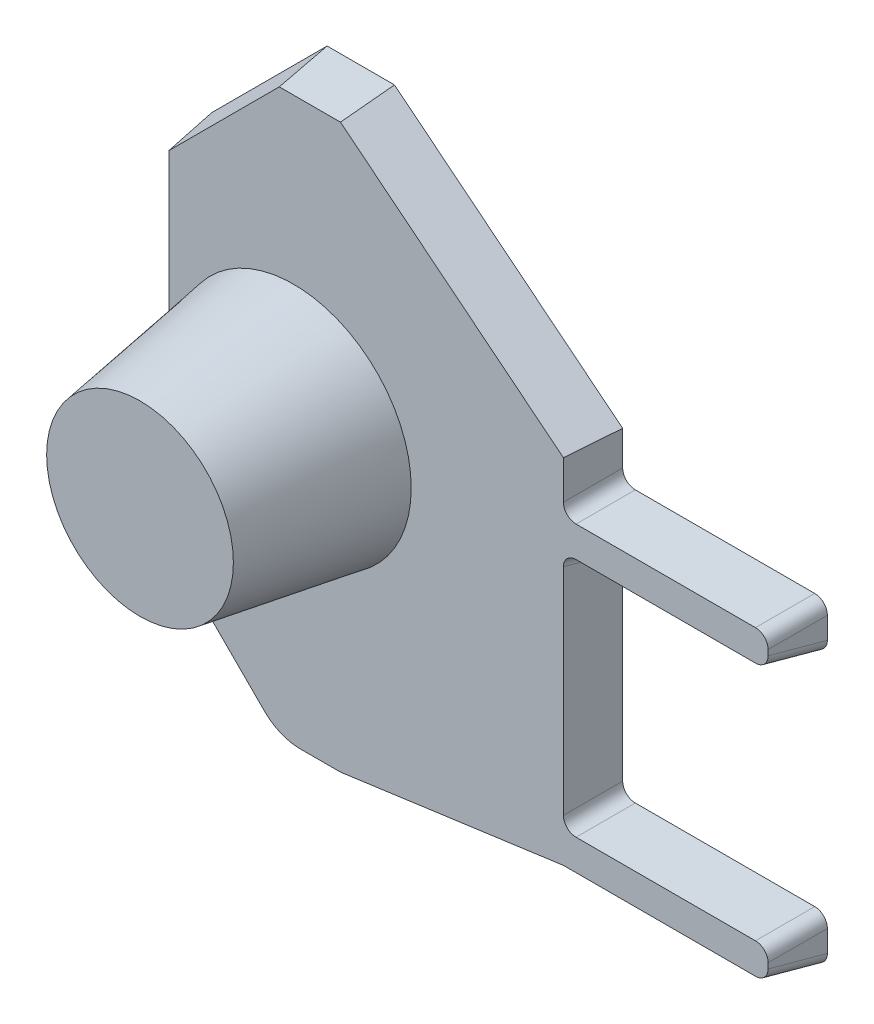
ISO-10303-21;
HEADER;
FILE_DESCRIPTION(('STEP AP214'),'2;1');
FILE_NAME('part.step','',(''),(''),'','','');
FILE_SCHEMA(('AUTOMOTIVE_DESIGN { 1 0 10303 214 1 1 1 1 }'));
ENDSEC;
DATA;
#1=APPLICATION_CONTEXT('core data for automotive mechanical design processes');
#2=APPLICATION_PROTOCOL_DEFINITION('international standard','automotive_design',2000,#1);
#3=PRODUCT_CONTEXT('',#1,'mechanical');
#4=PRODUCT('Part','Part','',(#3));
#5=PRODUCT_RELATED_PRODUCT_CATEGORY('part','',(#4));
#6=PRODUCT_DEFINITION_FORMATION('','',#4);
#7=PRODUCT_DEFINITION_CONTEXT('part definition',#1,'design');
#8=PRODUCT_DEFINITION('design','',#6,#7);
#9=PRODUCT_DEFINITION_SHAPE('','',#8);
#10=(LENGTH_UNIT() NAMED_UNIT(*) SI_UNIT(.MILLI.,.METRE.));
#11=(NAMED_UNIT(*) PLANE_ANGLE_UNIT() SI_UNIT($,.RADIAN.));
#12=(NAMED_UNIT(*) SI_UNIT($,.STERADIAN.) SOLID_ANGLE_UNIT());
#13=UNCERTAINTY_MEASURE_WITH_UNIT(LENGTH_MEASURE(1.E-05),#10,'distance_accuracy_value','');
#14=(GEOMETRIC_REPRESENTATION_CONTEXT(3) GLOBAL_UNCERTAINTY_ASSIGNED_CONTEXT((#13)) GLOBAL_UNIT_ASSIGNED_CONTEXT((#10,
#11,#12)) REPRESENTATION_CONTEXT('',''));
#15=CARTESIAN_POINT('',(0.,0.,0.));
#16=DIRECTION('',(0.,0.,1.));
#17=DIRECTION('',(1.,0.,0.));
#18=AXIS2_PLACEMENT_3D('',#15,#16,#17);
#19=CARTESIAN_POINT('',(-40.4268302290652,-40.6742121299792,-0.0633693031585517));
#20=DIRECTION('',(-0.69840112333371,-0.69840112333371,0.156434465040231));
#21=DIRECTION('',(0.707106781186547,-0.707106781186547,0.));
#22=AXIS2_PLACEMENT_3D('',#19,#20,#21);
#23=PLANE('',#22);
#24=DIRECTION('',(0.707106781186547,-0.707106781186547,0.));
#25=VECTOR('',#24,1.);
#26=CARTESIAN_POINT('',(-41.6027747028383,-41.8501566037523,-10.5633693031586));
#27=LINE('',#26,#25);
#28=CARTESIAN_POINT('',(-47.8486528709108,-35.6042784356798,-10.5633693031586));
#29=VERTEX_POINT('',#28);
#30=CARTESIAN_POINT('',(-27.2386149479719,-56.2143163586187,-10.5633693031586));
#31=VERTEX_POINT('',#30);
#32=EDGE_CURVE('E261',#29,#31,#27,.T.);
#33=ORIENTED_EDGE('',*,*,#32,.T.);
#34=DIRECTION('',(0.0646616721689631,0.156107085916033,0.98562135015386));
#35=VECTOR('',#34,1.);
#36=CARTESIAN_POINT('',(-26.4677073376156,-54.3531807503599,1.18737846250103));
#37=LINE('',#36,#35);
#38=CARTESIAN_POINT('',(-26.5497626238333,-54.5512797352111,-0.0633693031585517));
#39=VERTEX_POINT('',#38);
#40=EDGE_CURVE('E313',#31,#39,#37,.T.);
#41=ORIENTED_EDGE('',*,*,#40,.T.);
#42=DIRECTION('',(0.707106781186548,-0.707106781186548,0.));
#43=VECTOR('',#42,1.);
#44=CARTESIAN_POINT('',(-40.4268302290652,-40.6742121299792,-0.0633693031585517));
#45=LINE('',#44,#43);
#46=CARTESIAN_POINT('',(-46.1856162475031,-34.9154261115412,-0.0633693031585517));
#47=VERTEX_POINT('',#46);
#48=EDGE_CURVE('E211',#47,#39,#45,.T.);
#49=ORIENTED_EDGE('',*,*,#48,.F.);
#50=DIRECTION('',(0.156107085916033,0.064661672168963,0.98562135015386));
#51=VECTOR('',#50,1.);
#52=CARTESIAN_POINT('',(-45.8315476447022,-34.7687660942506,2.17213187407477));
#53=LINE('',#52,#51);
#54=EDGE_CURVE('E262',#29,#47,#53,.T.);
#55=ORIENTED_EDGE('',*,*,#54,.F.);
#56=EDGE_LOOP('',(#33,#41,#49,#55));
#57=FACE_BOUND('',#56,.T.);
#58=ADVANCED_FACE('F44',(#57),#23,.T.);
#59=CARTESIAN_POINT('',(-46.1856162475032,0.161204483543927,-0.0633693031585517));
#60=DIRECTION('',(-0.987688340595138,0.,0.156434465040231));
#61=DIRECTION('',(0.156434465040231,0.,0.987688340595138));
#62=AXIS2_PLACEMENT_3D('',#59,#60,#61);
#63=PLANE('',#62);
#64=DIRECTION('',(0.,-1.,0.));
#65=VECTOR('',#64,1.);
#66=CARTESIAN_POINT('',(-46.1856162475032,0.161204483543927,-0.0633693031585517));
#67=LINE('',#66,#65);
#68=CARTESIAN_POINT('',(-46.1856162475032,35.2378350786292,-0.0633693031585517));
#69=VERTEX_POINT('',#68);
#70=EDGE_CURVE('E258',#69,#47,#67,.T.);
#71=ORIENTED_EDGE('',*,*,#70,.F.);
#72=DIRECTION('',(0.156107085916033,-0.0646616721689629,0.98562135015386));
#73=VECTOR('',#72,1.);
#74=CARTESIAN_POINT('',(-46.1034079815582,35.2037832999356,0.455673260470475));
#75=LINE('',#74,#73);
#76=CARTESIAN_POINT('',(-47.8486528709108,35.9266874027678,-10.5633693031586));
#77=VERTEX_POINT('',#76);
#78=EDGE_CURVE('E264',#77,#69,#75,.T.);
#79=ORIENTED_EDGE('',*,*,#78,.F.);
#80=DIRECTION('',(0.,-1.,0.));
#81=VECTOR('',#80,1.);
#82=CARTESIAN_POINT('',(-47.8486528709108,0.161204483543925,-10.5633693031586));
#83=LINE('',#82,#81);
#84=EDGE_CURVE('E222',#77,#29,#83,.T.);
#85=ORIENTED_EDGE('',*,*,#84,.T.);
#86=ORIENTED_EDGE('',*,*,#54,.T.);
#87=EDGE_LOOP('',(#71,#79,#85,#86));
#88=FACE_BOUND('',#87,.T.);
#89=ADVANCED_FACE('F466',(#88),#63,.T.);
#90=CARTESIAN_POINT('',(-40.4268302290653,40.9966210970671,-0.0633693031585517));
#91=DIRECTION('',(-0.69840112333371,0.69840112333371,0.156434465040231));
#92=DIRECTION('',(-0.707106781186547,-0.707106781186547,0.));
#93=AXIS2_PLACEMENT_3D('',#90,#91,#92);
#94=PLANE('',#93);
#95=DIRECTION('',(-0.707106781186548,-0.707106781186548,0.));
#96=VECTOR('',#95,1.);
#97=CARTESIAN_POINT('',(-40.4268302290653,40.9966210970671,-0.0633693031585517));
#98=LINE('',#97,#96);
#99=CARTESIAN_POINT('',(-23.5122468425885,57.911204483544,-0.0633693031585517));
#100=VERTEX_POINT('',#99);
#101=EDGE_CURVE('E255',#100,#69,#98,.T.);
#102=ORIENTED_EDGE('',*,*,#101,.F.);
#103=DIRECTION('',(-0.0646616721689629,0.156107085916033,-0.98562135015386));
#104=VECTOR('',#103,1.);
#105=CARTESIAN_POINT('',(-23.4122306849597,57.6697441193401,1.46115143706775));
#106=LINE('',#105,#104);
#107=CARTESIAN_POINT('',(-24.2010991667271,59.5742411069516,-10.5633693031586));
#108=VERTEX_POINT('',#107);
#109=EDGE_CURVE('E273',#108,#100,#106,.F.);
#110=ORIENTED_EDGE('',*,*,#109,.F.);
#111=DIRECTION('',(-0.707106781186547,-0.707106781186547,0.));
#112=VECTOR('',#111,1.);
#113=CARTESIAN_POINT('',(-41.6027747028384,42.1725655708403,-10.5633693031586));
#114=LINE('',#113,#112);
#115=EDGE_CURVE('E280',#108,#77,#114,.T.);
#116=ORIENTED_EDGE('',*,*,#115,.T.);
#117=ORIENTED_EDGE('',*,*,#78,.T.);
#118=EDGE_LOOP('',(#102,#110,#116,#117));
#119=FACE_BOUND('',#118,.T.);
#120=ADVANCED_FACE('F471',(#119),#94,.T.);
#121=CARTESIAN_POINT('',(0.408586384457905,57.911204483544,-0.0633693031585517));
#122=DIRECTION('',(0.,0.987688340595138,0.156434465040231));
#123=DIRECTION('',(0.,-0.156434465040231,0.987688340595138));
#124=AXIS2_PLACEMENT_3D('',#121,#122,#123);
#125=PLANE('',#124);
#126=DIRECTION('',(1.,0.,0.));
#127=VECTOR('',#126,1.);
#128=CARTESIAN_POINT('',(0.408586384457905,57.911204483544,-0.0633693031585517));
#129=LINE('',#128,#127);
#130=CARTESIAN_POINT('',(-10.9585190266833,57.911204483544,-0.0633693031585517));
#131=VERTEX_POINT('',#130);
#132=EDGE_CURVE('E253',#100,#131,#129,.T.);
#133=ORIENTED_EDGE('',*,*,#132,.T.);
#134=DIRECTION('',(-0.0549699216954338,-0.156197937818383,0.986194966489934));
#135=VECTOR('',#134,1.);
#136=CARTESIAN_POINT('',(-11.0945846883405,57.5245716650274,2.37773424037382));
#137=LINE('',#136,#135);
#138=CARTESIAN_POINT('',(-10.3732552630115,59.5742411069516,-10.5633693031586));
#139=VERTEX_POINT('',#138);
#140=EDGE_CURVE('E270',#139,#131,#137,.T.);
#141=ORIENTED_EDGE('',*,*,#140,.F.);
#142=DIRECTION('',(-1.,0.,0.));
#143=VECTOR('',#142,1.);
#144=CARTESIAN_POINT('',(0.408586384457905,59.5742411069516,-10.5633693031586));
#145=LINE('',#144,#143);
#146=EDGE_CURVE('E283',#108,#139,#145,.F.);
#147=ORIENTED_EDGE('',*,*,#146,.F.);
#148=ORIENTED_EDGE('',*,*,#109,.T.);
#149=EDGE_LOOP('',(#133,#141,#147,#148));
#150=FACE_BOUND('',#149,.T.);
#151=ADVANCED_FACE('F505',(#150),#125,.T.);
#152=CARTESIAN_POINT('',(24.1463617540273,29.7098888695739,-0.0633693031585517));
#153=DIRECTION('',(0.618573050083184,0.769997168733992,0.156434465040231));
#154=DIRECTION('',(-0.779595280298667,0.62628364096154,0.));
#155=AXIS2_PLACEMENT_3D('',#152,#153,#154);
#156=PLANE('',#155);
#157=DIRECTION('',(0.779595280298667,-0.62628364096154,0.));
#158=VECTOR('',#157,1.);
#159=CARTESIAN_POINT('',(24.1463617540273,29.7098888695739,-0.0633693031585517));
#160=LINE('',#159,#158);
#161=CARTESIAN_POINT('',(34.7877286431252,21.161204483544,-0.0633693031585517));
#162=VERTEX_POINT('',#161);
#163=EDGE_CURVE('E251',#131,#162,#160,.T.);
#164=ORIENTED_EDGE('',*,*,#163,.T.);
#165=DIRECTION('',(-0.155996452907658,-0.0747803737103569,0.98492284082966));
#166=VECTOR('',#165,1.);
#167=CARTESIAN_POINT('',(34.5427537091607,21.0437702934065,1.48334155721672));
#168=LINE('',#167,#166);
#169=CARTESIAN_POINT('',(36.4507652665328,21.9584181244596,-10.5633693031586));
#170=VERTEX_POINT('',#169);
#171=EDGE_CURVE('E267',#170,#162,#168,.T.);
#172=ORIENTED_EDGE('',*,*,#171,.F.);
#173=DIRECTION('',(-0.779595280298667,0.62628364096154,0.));
#174=VECTOR('',#173,1.);
#175=CARTESIAN_POINT('',(25.1878943855874,31.0063843721463,-10.5633693031586));
#176=LINE('',#175,#174);
#177=EDGE_CURVE('E285',#139,#170,#176,.F.);
#178=ORIENTED_EDGE('',*,*,#177,.F.);
#179=ORIENTED_EDGE('',*,*,#140,.T.);
#180=EDGE_LOOP('',(#164,#172,#178,#179));
#181=FACE_BOUND('',#180,.T.);
#182=ADVANCED_FACE('F501',(#181),#156,.T.);
#183=CARTESIAN_POINT('',(34.7877286431252,0.161204483543965,-0.0633693031585517));
#184=DIRECTION('',(0.987688340595138,0.,0.156434465040231));
#185=DIRECTION('',(0.156434465040231,0.,-0.987688340595138));
#186=AXIS2_PLACEMENT_3D('',#183,#184,#185);
#187=PLANE('',#186);
#188=DIRECTION('',(0.,-1.,0.));
#189=VECTOR('',#188,1.);
#190=CARTESIAN_POINT('',(34.7877286431252,0.161204483543965,-0.0633693031585517));
#191=LINE('',#190,#189);
#192=CARTESIAN_POINT('',(34.7877286431252,13.2538863776062,-0.0633693031585517));
#193=VERTEX_POINT('',#192);
#194=EDGE_CURVE('E248',#162,#193,#191,.T.);
#195=ORIENTED_EDGE('',*,*,#194,.T.);
#196=DIRECTION('',(0.154554782932108,0.154554782932108,-0.975820494837866));
#197=VECTOR('',#196,1.);
#198=CARTESIAN_POINT('',(36.3888334050427,14.8549911395237,-10.1723469188687));
#199=LINE('',#198,#197);
#200=CARTESIAN_POINT('',(36.4507652665328,14.9169230010138,-10.5633693031586));
#201=VERTEX_POINT('',#200);
#202=EDGE_CURVE('E368',#193,#201,#199,.T.);
#203=ORIENTED_EDGE('',*,*,#202,.T.);
#204=DIRECTION('',(0.,1.,0.));
#205=VECTOR('',#204,1.);
#206=CARTESIAN_POINT('',(36.4507652665328,0.161204483543965,-10.5633693031586));
#207=LINE('',#206,#205);
#208=EDGE_CURVE('E287',#170,#201,#207,.F.);
#209=ORIENTED_EDGE('',*,*,#208,.F.);
#210=ORIENTED_EDGE('',*,*,#171,.T.);
#211=EDGE_LOOP('',(#195,#203,#209,#210));
#212=FACE_BOUND('',#211,.T.);
#213=ADVANCED_FACE('F497',(#212),#187,.T.);
#214=CARTESIAN_POINT('',(0.408586384457905,10.661204483544,-0.0633693031585517));
#215=DIRECTION('',(0.,0.987688340595138,0.156434465040231));
#216=DIRECTION('',(0.,-0.156434465040231,0.987688340595138));
#217=AXIS2_PLACEMENT_3D('',#214,#215,#216);
#218=PLANE('',#217);
#219=DIRECTION('',(1.,0.,0.));
#220=VECTOR('',#219,1.);
#221=CARTESIAN_POINT('',(0.408586384457905,10.661204483544,-0.0633693031585517));
#222=LINE('',#221,#220);
#223=CARTESIAN_POINT('',(37.3804105371874,10.661204483544,-0.0633693031585517));
#224=VERTEX_POINT('',#223);
#225=CARTESIAN_POINT('',(74.1950467490629,10.661204483544,-0.0633693031585517));
#226=VERTEX_POINT('',#225);
#227=EDGE_CURVE('E245',#224,#226,#222,.T.);
#228=ORIENTED_EDGE('',*,*,#227,.T.);
#229=DIRECTION('',(-0.154554782932108,-0.154554782932108,0.975820494837866));
#230=VECTOR('',#229,1.);
#231=CARTESIAN_POINT('',(75.9200152339607,12.3861729684417,-10.9543916874484));
#232=LINE('',#231,#230);
#233=CARTESIAN_POINT('',(75.8580833724706,12.3242411069516,-10.5633693031586));
#234=VERTEX_POINT('',#233);
#235=EDGE_CURVE('E348',#226,#234,#232,.F.);
#236=ORIENTED_EDGE('',*,*,#235,.T.);
#237=DIRECTION('',(-1.,0.,0.));
#238=VECTOR('',#237,1.);
#239=CARTESIAN_POINT('',(0.408586384457905,12.3242411069516,-10.5633693031586));
#240=LINE('',#239,#238);
#241=CARTESIAN_POINT('',(39.043447160595,12.3242411069516,-10.5633693031586));
#242=VERTEX_POINT('',#241);
#243=EDGE_CURVE('E290',#242,#234,#240,.F.);
#244=ORIENTED_EDGE('',*,*,#243,.F.);
#245=DIRECTION('',(0.154554782932108,0.154554782932108,-0.975820494837866));
#246=VECTOR('',#245,1.);
#247=CARTESIAN_POINT('',(37.3184786756973,10.5992726220539,0.327653081131317));
#248=LINE('',#247,#246);
#249=EDGE_CURVE('E345',#242,#224,#248,.F.);
#250=ORIENTED_EDGE('',*,*,#249,.T.);
#251=EDGE_LOOP('',(#228,#236,#244,#250));
#252=FACE_BOUND('',#251,.T.);
#253=ADVANCED_FACE('F493',(#252),#218,.T.);
#254=CARTESIAN_POINT('',(76.7877286431252,0.161204483543965,-0.0633693031585517));
#255=DIRECTION('',(0.987688340595138,0.,0.156434465040231));
#256=DIRECTION('',(0.156434465040231,0.,-0.987688340595138));
#257=AXIS2_PLACEMENT_3D('',#254,#255,#256);
#258=PLANE('',#257);
#259=DIRECTION('',(0.,1.,0.));
#260=VECTOR('',#259,1.);
#261=CARTESIAN_POINT('',(76.7877286431252,0.161204483543965,-0.0633693031585517));
#262=LINE('',#261,#260);
#263=CARTESIAN_POINT('',(76.7877286431252,6.95388637760621,-0.0633693031585517));
#264=VERTEX_POINT('',#263);
#265=CARTESIAN_POINT('',(76.7877286431252,8.06852258948174,-0.0633693031585517));
#266=VERTEX_POINT('',#265);
#267=EDGE_CURVE('E242',#264,#266,#262,.T.);
#268=ORIENTED_EDGE('',*,*,#267,.F.);
#269=DIRECTION('',(-0.154554782932108,0.154554782932108,0.975820494837866));
#270=VECTOR('',#269,1.);
#271=CARTESIAN_POINT('',(76.9499866645095,6.79162835622189,-1.08782613144197));
#272=LINE('',#271,#270);
#273=CARTESIAN_POINT('',(78.4507652665328,5.29084975419858,-10.5633693031586));
#274=VERTEX_POINT('',#273);
#275=EDGE_CURVE('E337',#264,#274,#272,.F.);
#276=ORIENTED_EDGE('',*,*,#275,.T.);
#277=DIRECTION('',(0.,1.,0.));
#278=VECTOR('',#277,1.);
#279=CARTESIAN_POINT('',(78.4507652665328,0.161204483543965,-10.5633693031586));
#280=LINE('',#279,#278);
#281=CARTESIAN_POINT('',(78.4507652665328,9.73155921288937,-10.5633693031586));
#282=VERTEX_POINT('',#281);
#283=EDGE_CURVE('E293',#274,#282,#280,.T.);
#284=ORIENTED_EDGE('',*,*,#283,.T.);
#285=DIRECTION('',(0.154554782932108,0.154554782932108,-0.975820494837866));
#286=VECTOR('',#285,1.);
#287=CARTESIAN_POINT('',(76.8496605046153,8.13045445097186,-0.454391687448422));
#288=LINE('',#287,#286);
#289=EDGE_CURVE('E334',#282,#266,#288,.F.);
#290=ORIENTED_EDGE('',*,*,#289,.T.);
#291=EDGE_LOOP('',(#268,#276,#284,#290));
#292=FACE_BOUND('',#291,.T.);
#293=ADVANCED_FACE('F490',(#292),#258,.T.);
#294=CARTESIAN_POINT('',(0.408586384457905,4.36120448354398,-0.0633693031585517));
#295=DIRECTION('',(0.,-0.987688340595138,0.156434465040231));
#296=DIRECTION('',(0.,-0.156434465040231,-0.987688340595138));
#297=AXIS2_PLACEMENT_3D('',#294,#295,#296);
#298=PLANE('',#297);
#299=DIRECTION('',(1.,0.,0.));
#300=VECTOR('',#299,1.);
#301=CARTESIAN_POINT('',(0.408586384457905,2.69816786013634,-10.5633693031586));
#302=LINE('',#301,#300);
#303=CARTESIAN_POINT('',(39.043447160595,2.69816786013634,-10.5633693031586));
#304=VERTEX_POINT('',#303);
#305=CARTESIAN_POINT('',(75.8580833724706,2.69816786013634,-10.5633693031586));
#306=VERTEX_POINT('',#305);
#307=EDGE_CURVE('E296',#304,#306,#302,.T.);
#308=ORIENTED_EDGE('',*,*,#307,.T.);
#309=DIRECTION('',(-0.154554782932108,0.154554782932108,0.975820494837866));
#310=VECTOR('',#309,1.);
#311=CARTESIAN_POINT('',(72.4324962203567,6.1237550122503,11.0649367671523));
#312=LINE('',#311,#310);
#313=CARTESIAN_POINT('',(74.195046749063,4.36120448354398,-0.0633693031585517));
#314=VERTEX_POINT('',#313);
#315=EDGE_CURVE('E323',#306,#314,#312,.T.);
#316=ORIENTED_EDGE('',*,*,#315,.T.);
#317=DIRECTION('',(1.,0.,0.));
#318=VECTOR('',#317,1.);
#319=CARTESIAN_POINT('',(0.408586384457905,4.36120448354398,-0.0633693031585517));
#320=LINE('',#319,#318);
#321=CARTESIAN_POINT('',(37.3804105371874,4.36120448354398,-0.0633693031585517));
#322=VERTEX_POINT('',#321);
#323=EDGE_CURVE('E240',#322,#314,#320,.T.);
#324=ORIENTED_EDGE('',*,*,#323,.F.);
#325=DIRECTION('',(0.154554782932108,-0.154554782932108,-0.975820494837866));
#326=VECTOR('',#325,1.);
#327=CARTESIAN_POINT('',(36.4972578844429,5.24435713628851,5.51263709579655));
#328=LINE('',#327,#326);
#329=EDGE_CURVE('E321',#322,#304,#328,.T.);
#330=ORIENTED_EDGE('',*,*,#329,.T.);
#331=EDGE_LOOP('',(#308,#316,#324,#330));
#332=FACE_BOUND('',#331,.T.);
#333=ADVANCED_FACE('F383',(#332),#298,.T.);
#334=CARTESIAN_POINT('',(34.7877286431252,0.161204483543965,-0.0633693031585517));
#335=DIRECTION('',(0.987688340595138,0.,0.156434465040231));
#336=DIRECTION('',(0.156434465040231,0.,-0.987688340595138));
#337=AXIS2_PLACEMENT_3D('',#334,#335,#336);
#338=PLANE('',#337);
#339=DIRECTION('',(0.,-1.,0.));
#340=VECTOR('',#339,1.);
#341=CARTESIAN_POINT('',(34.7877286431252,0.161204483543965,-0.0633693031585517));
#342=LINE('',#341,#340);
#343=CARTESIAN_POINT('',(34.7877286431252,1.76852258948174,-0.0633693031585517));
#344=VERTEX_POINT('',#343);
#345=CARTESIAN_POINT('',(34.7877286431252,-42.3961136223938,-0.0633693031585517));
#346=VERTEX_POINT('',#345);
#347=EDGE_CURVE('E237',#344,#346,#342,.T.);
#348=ORIENTED_EDGE('',*,*,#347,.T.);
#349=DIRECTION('',(0.154554782932108,0.154554782932108,-0.975820494837866));
#350=VECTOR('',#349,1.);
#351=CARTESIAN_POINT('',(36.3888334050427,-40.7950088604763,-10.1723469188687));
#352=LINE('',#351,#350);
#353=CARTESIAN_POINT('',(36.4507652665328,-40.7330769989861,-10.5633693031586));
#354=VERTEX_POINT('',#353);
#355=EDGE_CURVE('E366',#346,#354,#352,.T.);
#356=ORIENTED_EDGE('',*,*,#355,.T.);
#357=DIRECTION('',(0.,1.,0.));
#358=VECTOR('',#357,1.);
#359=CARTESIAN_POINT('',(36.4507652665328,0.161204483543965,-10.5633693031586));
#360=LINE('',#359,#358);
#361=CARTESIAN_POINT('',(36.4507652665328,0.105485966074106,-10.5633693031586));
#362=VERTEX_POINT('',#361);
#363=EDGE_CURVE('E299',#362,#354,#360,.F.);
#364=ORIENTED_EDGE('',*,*,#363,.F.);
#365=DIRECTION('',(-0.154554782932108,0.154554782932108,0.975820494837866));
#366=VECTOR('',#365,1.);
#367=CARTESIAN_POINT('',(34.8261229415293,1.73012829107765,-0.305781362862232));
#368=LINE('',#367,#366);
#369=EDGE_CURVE('E363',#362,#344,#368,.T.);
#370=ORIENTED_EDGE('',*,*,#369,.T.);
#371=EDGE_LOOP('',(#348,#356,#364,#370));
#372=FACE_BOUND('',#371,.T.);
#373=ADVANCED_FACE('F392',(#372),#338,.T.);
#374=CARTESIAN_POINT('',(0.408586384457905,-44.988795516456,-0.0633693031585517));
#375=DIRECTION('',(0.,0.987688340595138,0.156434465040231));
#376=DIRECTION('',(0.,-0.156434465040231,0.987688340595138));
#377=AXIS2_PLACEMENT_3D('',#374,#375,#376);
#378=PLANE('',#377);
#379=DIRECTION('',(1.,0.,0.));
#380=VECTOR('',#379,1.);
#381=CARTESIAN_POINT('',(0.408586384457905,-44.988795516456,-0.0633693031585517));
#382=LINE('',#381,#380);
#383=CARTESIAN_POINT('',(37.3804105371874,-44.988795516456,-0.0633693031585517));
#384=VERTEX_POINT('',#383);
#385=CARTESIAN_POINT('',(74.1950467490629,-44.988795516456,-0.0633693031585517));
#386=VERTEX_POINT('',#385);
#387=EDGE_CURVE('E234',#384,#386,#382,.T.);
#388=ORIENTED_EDGE('',*,*,#387,.T.);
#389=DIRECTION('',(-0.154554782932108,-0.154554782932108,0.975820494837866));
#390=VECTOR('',#389,1.);
#391=CARTESIAN_POINT('',(75.9200152339607,-43.2638270315583,-10.9543916874484));
#392=LINE('',#391,#390);
#393=CARTESIAN_POINT('',(75.8580833724706,-43.3257588930484,-10.5633693031586));
#394=VERTEX_POINT('',#393);
#395=EDGE_CURVE('E361',#386,#394,#392,.F.);
#396=ORIENTED_EDGE('',*,*,#395,.T.);
#397=DIRECTION('',(-1.,0.,0.));
#398=VECTOR('',#397,1.);
#399=CARTESIAN_POINT('',(0.408586384457905,-43.3257588930484,-10.5633693031586));
#400=LINE('',#399,#398);
#401=CARTESIAN_POINT('',(39.043447160595,-43.3257588930484,-10.5633693031586));
#402=VERTEX_POINT('',#401);
#403=EDGE_CURVE('E302',#402,#394,#400,.F.);
#404=ORIENTED_EDGE('',*,*,#403,.F.);
#405=DIRECTION('',(0.154554782932108,0.154554782932108,-0.975820494837866));
#406=VECTOR('',#405,1.);
#407=CARTESIAN_POINT('',(37.3184786756973,-45.0507273779461,0.327653081131317));
#408=LINE('',#407,#406);
#409=EDGE_CURVE('E358',#402,#384,#408,.F.);
#410=ORIENTED_EDGE('',*,*,#409,.T.);
#411=EDGE_LOOP('',(#388,#396,#404,#410));
#412=FACE_BOUND('',#411,.T.);
#413=ADVANCED_FACE('F399',(#412),#378,.T.);
#414=CARTESIAN_POINT('',(76.7877286431252,0.161204483543965,-0.0633693031585517));
#415=DIRECTION('',(0.987688340595138,0.,0.156434465040231));
#416=DIRECTION('',(0.156434465040231,0.,-0.987688340595138));
#417=AXIS2_PLACEMENT_3D('',#414,#415,#416);
#418=PLANE('',#417);
#419=DIRECTION('',(0.,1.,0.));
#420=VECTOR('',#419,1.);
#421=CARTESIAN_POINT('',(76.7877286431252,0.161204483543965,-0.0633693031585517));
#422=LINE('',#421,#420);
#423=CARTESIAN_POINT('',(76.7877286431252,-48.6961136223938,-0.0633693031585517));
#424=VERTEX_POINT('',#423);
#425=CARTESIAN_POINT('',(76.7877286431252,-47.5814774105182,-0.0633693031585517));
#426=VERTEX_POINT('',#425);
#427=EDGE_CURVE('E228',#424,#426,#422,.T.);
#428=ORIENTED_EDGE('',*,*,#427,.F.);
#429=DIRECTION('',(-0.154554782932108,0.154554782932108,0.975820494837866));
#430=VECTOR('',#429,1.);
#431=CARTESIAN_POINT('',(75.6206650459113,-47.5290500251799,7.30518025147253));
#432=LINE('',#431,#430);
#433=CARTESIAN_POINT('',(78.4507652665328,-50.3591502458014,-10.5633693031586));
#434=VERTEX_POINT('',#433);
#435=EDGE_CURVE('E356',#424,#434,#432,.F.);
#436=ORIENTED_EDGE('',*,*,#435,.T.);
#437=DIRECTION('',(0.,1.,0.));
#438=VECTOR('',#437,1.);
#439=CARTESIAN_POINT('',(78.4507652665328,0.161204483543965,-10.5633693031586));
#440=LINE('',#439,#438);
#441=CARTESIAN_POINT('',(78.4507652665328,-45.9184407871106,-10.5633693031586));
#442=VERTEX_POINT('',#441);
#443=EDGE_CURVE('E304',#434,#442,#440,.T.);
#444=ORIENTED_EDGE('',*,*,#443,.T.);
#445=DIRECTION('',(0.154554782932108,0.154554782932108,-0.975820494837866));
#446=VECTOR('',#445,1.);
#447=CARTESIAN_POINT('',(76.8496605046153,-47.5195455490281,-0.454391687448418));
#448=LINE('',#447,#446);
#449=EDGE_CURVE('E353',#442,#426,#448,.F.);
#450=ORIENTED_EDGE('',*,*,#449,.T.);
#451=EDGE_LOOP('',(#428,#436,#444,#450));
#452=FACE_BOUND('',#451,.T.);
#453=ADVANCED_FACE('F407',(#452),#418,.T.);
#454=CARTESIAN_POINT('',(0.408586384457905,-51.288795516456,-0.0633693031585517));
#455=DIRECTION('',(0.,-0.987688340595138,0.156434465040231));
#456=DIRECTION('',(0.,-0.156434465040231,-0.987688340595138));
#457=AXIS2_PLACEMENT_3D('',#454,#455,#456);
#458=PLANE('',#457);
#459=DIRECTION('',(1.,0.,0.));
#460=VECTOR('',#459,1.);
#461=CARTESIAN_POINT('',(0.408586384457905,-52.9518321398637,-10.5633693031586));
#462=LINE('',#461,#460);
#463=CARTESIAN_POINT('',(34.9017043258418,-52.9518321398637,-10.5633693031586));
#464=VERTEX_POINT('',#463);
#465=CARTESIAN_POINT('',(75.8580833724706,-52.9518321398637,-10.5633693031586));
#466=VERTEX_POINT('',#465);
#467=EDGE_CURVE('E306',#464,#466,#462,.T.);
#468=ORIENTED_EDGE('',*,*,#467,.T.);
#469=DIRECTION('',(-0.154554782932108,0.154554782932108,0.975820494837866));
#470=VECTOR('',#469,1.);
#471=CARTESIAN_POINT('',(72.4324962203567,-49.5262449877497,11.0649367671523));
#472=LINE('',#471,#470);
#473=CARTESIAN_POINT('',(74.195046749063,-51.288795516456,-0.0633693031585517));
#474=VERTEX_POINT('',#473);
#475=EDGE_CURVE('E350',#466,#474,#472,.T.);
#476=ORIENTED_EDGE('',*,*,#475,.T.);
#477=DIRECTION('',(1.,0.,0.));
#478=VECTOR('',#477,1.);
#479=CARTESIAN_POINT('',(0.408586384457905,-51.288795516456,-0.0633693031585517));
#480=LINE('',#479,#478);
#481=CARTESIAN_POINT('',(34.7877286431252,-51.288795516456,-0.0633693031585517));
#482=VERTEX_POINT('',#481);
#483=EDGE_CURVE('E226',#482,#474,#480,.T.);
#484=ORIENTED_EDGE('',*,*,#483,.F.);
#485=DIRECTION('',(-0.0107205698794066,0.156425475227009,0.987631581148287));
#486=VECTOR('',#485,1.);
#487=CARTESIAN_POINT('',(34.7837774270407,-51.2311427180772,0.300636139931265));
#488=LINE('',#487,#486);
#489=EDGE_CURVE('E221',#464,#482,#488,.T.);
#490=ORIENTED_EDGE('',*,*,#489,.F.);
#491=EDGE_LOOP('',(#468,#476,#484,#490));
#492=FACE_BOUND('',#491,.T.);
#493=ADVANCED_FACE('F413',(#492),#458,.T.);
#494=CARTESIAN_POINT('',(8.0020953263395,-54.9776115066497,-0.0633693031585517));
#495=DIRECTION('',(0.134748892743105,-0.978453368358495,0.156434465040231));
#496=DIRECTION('',(0.,-0.157874313713471,-0.987459214889152));
#497=AXIS2_PLACEMENT_3D('',#494,#495,#496);
#498=PLANE('',#497);
#499=DIRECTION('',(0.990649912672778,0.136428554640942,0.));
#500=VECTOR('',#499,1.);
#501=CARTESIAN_POINT('',(8.0020953263395,-54.9776115066497,-0.0633693031585517));
#502=LINE('',#501,#500);
#503=CARTESIAN_POINT('',(-10.9585190266833,-57.5887955164561,-0.0633693031585517));
#504=VERTEX_POINT('',#503);
#505=EDGE_CURVE('E206',#504,#482,#502,.T.);
#506=ORIENTED_EDGE('',*,*,#505,.F.);
#507=DIRECTION('',(-0.0107205698794064,0.156425475227009,0.987631581148287));
#508=VECTOR('',#507,1.);
#509=CARTESIAN_POINT('',(-10.9572125982274,-57.6078578139238,-0.183723912668566));
#510=LINE('',#509,#508);
#511=CARTESIAN_POINT('',(-10.8445433439668,-59.2518321398637,-10.5633693031586));
#512=VERTEX_POINT('',#511);
#513=EDGE_CURVE('E214',#512,#504,#510,.T.);
#514=ORIENTED_EDGE('',*,*,#513,.F.);
#515=DIRECTION('',(0.990649912672779,0.136428554640942,0.));
#516=VECTOR('',#515,1.);
#517=CARTESIAN_POINT('',(8.22898100918595,-56.6250985924001,-10.5633693031586));
#518=LINE('',#517,#516);
#519=EDGE_CURVE('E308',#512,#464,#518,.T.);
#520=ORIENTED_EDGE('',*,*,#519,.T.);
#521=ORIENTED_EDGE('',*,*,#489,.T.);
#522=EDGE_LOOP('',(#506,#514,#520,#521));
#523=FACE_BOUND('',#522,.T.);
#524=ADVANCED_FACE('F224',(#523),#498,.T.);
#525=CARTESIAN_POINT('',(0.408586384457805,-57.5887955164561,-0.0633693031585517));
#526=DIRECTION('',(0.,-0.987688340595138,0.156434465040231));
#527=DIRECTION('',(0.,-0.156434465040231,-0.987688340595138));
#528=AXIS2_PLACEMENT_3D('',#525,#526,#527);
#529=PLANE('',#528);
#530=DIRECTION('',(1.,0.,0.));
#531=VECTOR('',#530,1.);
#532=CARTESIAN_POINT('',(0.408586384457805,-57.5887955164561,-0.0633693031585517));
#533=LINE('',#532,#531);
#534=CARTESIAN_POINT('',(-19.2165508288294,-57.588795516456,-0.0633693031585517));
#535=VERTEX_POINT('',#534);
#536=EDGE_CURVE('E200',#535,#504,#533,.T.);
#537=ORIENTED_EDGE('',*,*,#536,.F.);
#538=DIRECTION('',(0.0646616721689631,0.156107085916033,0.98562135015386));
#539=VECTOR('',#538,1.);
#540=CARTESIAN_POINT('',(-19.1344955426117,-57.3906965316049,1.18737846250102));
#541=LINE('',#540,#539);
#542=CARTESIAN_POINT('',(-19.905403152968,-59.2518321398637,-10.5633693031586));
#543=VERTEX_POINT('',#542);
#544=EDGE_CURVE('E317',#535,#543,#541,.F.);
#545=ORIENTED_EDGE('',*,*,#544,.T.);
#546=DIRECTION('',(1.,0.,0.));
#547=VECTOR('',#546,1.);
#548=CARTESIAN_POINT('',(0.408586384457802,-59.2518321398637,-10.5633693031586));
#549=LINE('',#548,#547);
#550=EDGE_CURVE('E217',#543,#512,#549,.T.);
#551=ORIENTED_EDGE('',*,*,#550,.T.);
#552=ORIENTED_EDGE('',*,*,#513,.T.);
#553=EDGE_LOOP('',(#537,#545,#551,#552));
#554=FACE_BOUND('',#553,.T.);
#555=ADVANCED_FACE('F215',(#554),#529,.T.);
#556=CARTESIAN_POINT('',(0.408586384457905,0.161204483543965,-10.5633693031586));
#557=DIRECTION('',(0.,0.,1.));
#558=DIRECTION('',(1.,0.,0.));
#559=AXIS2_PLACEMENT_3D('',#556,#557,#558);
#560=PLANE('',#559);
#561=CARTESIAN_POINT('',(-10.,25.,-10.5633693031586));
#562=DIRECTION('',(0.,0.,-1.));
#563=DIRECTION('',(-1.,0.,0.));
#564=AXIS2_PLACEMENT_3D('',#561,#562,#563);
#565=CIRCLE('',#564,2.5);
#566=CARTESIAN_POINT('',(-12.5,25.,-10.5633693031586));
#567=VERTEX_POINT('',#566);
#568=EDGE_CURVE('E433',#567,#567,#565,.T.);
#569=ORIENTED_EDGE('',*,*,#568,.F.);
#570=EDGE_LOOP('',(#569));
#571=FACE_BOUND('',#570,.T.);
#572=CARTESIAN_POINT('',(-10.,-25.,-10.5633693031586));
#573=DIRECTION('',(0.,0.,-1.));
#574=DIRECTION('',(-1.,0.,0.));
#575=AXIS2_PLACEMENT_3D('',#572,#573,#574);
#576=CIRCLE('',#575,2.5);
#577=CARTESIAN_POINT('',(-12.5,-25.,-10.5633693031586));
#578=VERTEX_POINT('',#577);
#579=EDGE_CURVE('E430',#578,#578,#576,.T.);
#580=ORIENTED_EDGE('',*,*,#579,.F.);
#581=EDGE_LOOP('',(#580));
#582=FACE_BOUND('',#581,.T.);
#583=ORIENTED_EDGE('',*,*,#283,.F.);
#584=CARTESIAN_POINT('',(75.7930443113393,5.35588881532985,-10.5633693031586));
#585=DIRECTION('',(0.,0.,1.));
#586=DIRECTION('',(-0.707106781186548,0.707106781186548,0.));
#587=AXIS2_PLACEMENT_3D('',#584,#585,#586);
#588=ELLIPSE('',#587,2.69004393111885,2.625);
#589=EDGE_CURVE('E343',#274,#306,#588,.F.);
#590=ORIENTED_EDGE('',*,*,#589,.T.);
#591=ORIENTED_EDGE('',*,*,#307,.F.);
#592=CARTESIAN_POINT('',(39.1084862217263,0.0404469049428338,-10.5633693031586));
#593=DIRECTION('',(0.,0.,1.));
#594=DIRECTION('',(0.707106781186548,-0.707106781186548,0.));
#595=AXIS2_PLACEMENT_3D('',#592,#593,#594);
#596=ELLIPSE('',#595,2.69004393111885,2.625);
#597=EDGE_CURVE('E11',#304,#362,#596,.T.);
#598=ORIENTED_EDGE('',*,*,#597,.T.);
#599=ORIENTED_EDGE('',*,*,#363,.T.);
#600=CARTESIAN_POINT('',(39.1084862217263,-40.6680379378549,-10.5633693031586));
#601=DIRECTION('',(0.,0.,1.));
#602=DIRECTION('',(0.707106781186548,0.707106781186548,0.));
#603=AXIS2_PLACEMENT_3D('',#600,#601,#602);
#604=ELLIPSE('',#603,2.69004393111885,2.625);
#605=EDGE_CURVE('E372',#354,#402,#604,.T.);
#606=ORIENTED_EDGE('',*,*,#605,.T.);
#607=ORIENTED_EDGE('',*,*,#403,.T.);
#608=CARTESIAN_POINT('',(75.7930443113393,-45.9834798482419,-10.5633693031586));
#609=DIRECTION('',(0.,0.,1.));
#610=DIRECTION('',(-0.707106781186548,-0.707106781186548,0.));
#611=AXIS2_PLACEMENT_3D('',#608,#609,#610);
#612=ELLIPSE('',#611,2.69004393111885,2.625);
#613=EDGE_CURVE('E65',#394,#442,#612,.F.);
#614=ORIENTED_EDGE('',*,*,#613,.T.);
#615=ORIENTED_EDGE('',*,*,#443,.F.);
#616=CARTESIAN_POINT('',(75.7930443113393,-50.2941111846702,-10.5633693031586));
#617=DIRECTION('',(0.,0.,1.));
#618=DIRECTION('',(-0.707106781186548,0.707106781186548,0.));
#619=AXIS2_PLACEMENT_3D('',#616,#617,#618);
#620=ELLIPSE('',#619,2.69004393111885,2.625);
#621=EDGE_CURVE('E59',#434,#466,#620,.F.);
#622=ORIENTED_EDGE('',*,*,#621,.T.);
#623=ORIENTED_EDGE('',*,*,#467,.F.);
#624=ORIENTED_EDGE('',*,*,#519,.F.);
#625=ORIENTED_EDGE('',*,*,#550,.F.);
#626=CARTESIAN_POINT('',(-19.7976429081496,-48.6209483190896,-10.5633693031586));
#627=DIRECTION('',(0.,0.,1.));
#628=DIRECTION('',(0.382683432365091,0.923879532511287,0.));
#629=AXIS2_PLACEMENT_3D('',#626,#627,#628);
#630=ELLIPSE('',#629,10.6531783208236,10.5);
#631=EDGE_CURVE('E319',#543,#31,#630,.F.);
#632=ORIENTED_EDGE('',*,*,#631,.T.);
#633=ORIENTED_EDGE('',*,*,#32,.F.);
#634=ORIENTED_EDGE('',*,*,#84,.F.);
#635=ORIENTED_EDGE('',*,*,#115,.F.);
#636=ORIENTED_EDGE('',*,*,#146,.T.);
#637=ORIENTED_EDGE('',*,*,#177,.T.);
#638=ORIENTED_EDGE('',*,*,#208,.T.);
#639=CARTESIAN_POINT('',(39.1084862217263,14.9819620621451,-10.5633693031586));
#640=DIRECTION('',(0.,0.,1.));
#641=DIRECTION('',(0.707106781186548,0.707106781186548,0.));
#642=AXIS2_PLACEMENT_3D('',#639,#640,#641);
#643=ELLIPSE('',#642,2.69004393111885,2.625);
#644=EDGE_CURVE('E376',#201,#242,#643,.T.);
#645=ORIENTED_EDGE('',*,*,#644,.T.);
#646=ORIENTED_EDGE('',*,*,#243,.T.);
#647=CARTESIAN_POINT('',(75.7930443113393,9.6665201517581,-10.5633693031586));
#648=DIRECTION('',(0.,0.,1.));
#649=DIRECTION('',(-0.707106781186548,-0.707106781186548,0.));
#650=AXIS2_PLACEMENT_3D('',#647,#648,#649);
#651=ELLIPSE('',#650,2.69004393111885,2.625);
#652=EDGE_CURVE('E341',#234,#282,#651,.F.);
#653=ORIENTED_EDGE('',*,*,#652,.T.);
#654=EDGE_LOOP('',(#583,#590,#591,#598,#599,#606,#607,#614,#615,#622,#623,#624,#625,#632,#633,
#634,#635,#636,#637,#638,#645,#646,#653));
#655=FACE_BOUND('',#654,.T.);
#656=ADVANCED_FACE('F389',(#571,#582,#655),#560,.F.);
#657=CARTESIAN_POINT('',(0.408586384457905,0.161204483543965,-0.0633693031585517));
#658=DIRECTION('',(0.,0.,1.));
#659=DIRECTION('',(1.,0.,0.));
#660=AXIS2_PLACEMENT_3D('',#657,#658,#659);
#661=PLANE('',#660);
#662=CARTESIAN_POINT('',(-20.5914136155421,0.161204483543965,-0.0633693031585517));
#663=DIRECTION('',(0.,0.,1.));
#664=DIRECTION('',(1.,0.,0.));
#665=AXIS2_PLACEMENT_3D('',#662,#663,#664);
#666=CIRCLE('',#665,24.15);
#667=CARTESIAN_POINT('',(3.55858638445791,0.161204483543965,-0.0633693031585517));
#668=VERTEX_POINT('',#667);
#669=EDGE_CURVE('E263',#668,#668,#666,.T.);
#670=ORIENTED_EDGE('',*,*,#669,.F.);
#671=EDGE_LOOP('',(#670));
#672=FACE_BOUND('',#671,.T.);
#673=ORIENTED_EDGE('',*,*,#323,.T.);
#674=CARTESIAN_POINT('',(74.1300076879317,7.01892543873748,-0.0633693031585517));
#675=DIRECTION('',(0.,0.,1.));
#676=DIRECTION('',(-0.707106781186548,0.707106781186548,0.));
#677=AXIS2_PLACEMENT_3D('',#674,#675,#676);
#678=ELLIPSE('',#677,2.69004393111885,2.625);
#679=EDGE_CURVE('E332',#314,#264,#678,.T.);
#680=ORIENTED_EDGE('',*,*,#679,.T.);
#681=ORIENTED_EDGE('',*,*,#267,.T.);
#682=CARTESIAN_POINT('',(74.1300076879317,8.00348352835047,-0.0633693031585517));
#683=DIRECTION('',(0.,0.,1.));
#684=DIRECTION('',(-0.707106781186548,-0.707106781186548,0.));
#685=AXIS2_PLACEMENT_3D('',#682,#683,#684);
#686=ELLIPSE('',#685,2.69004393111885,2.625);
#687=EDGE_CURVE('E330',#266,#226,#686,.T.);
#688=ORIENTED_EDGE('',*,*,#687,.T.);
#689=ORIENTED_EDGE('',*,*,#227,.F.);
#690=CARTESIAN_POINT('',(37.4454495983187,13.3189254387375,-0.0633693031585517));
#691=DIRECTION('',(0.,0.,1.));
#692=DIRECTION('',(0.707106781186548,0.707106781186548,0.));
#693=AXIS2_PLACEMENT_3D('',#690,#691,#692);
#694=ELLIPSE('',#693,2.69004393111885,2.625);
#695=EDGE_CURVE('E374',#224,#193,#694,.F.);
#696=ORIENTED_EDGE('',*,*,#695,.T.);
#697=ORIENTED_EDGE('',*,*,#194,.F.);
#698=ORIENTED_EDGE('',*,*,#163,.F.);
#699=ORIENTED_EDGE('',*,*,#132,.F.);
#700=ORIENTED_EDGE('',*,*,#101,.T.);
#701=ORIENTED_EDGE('',*,*,#70,.T.);
#702=ORIENTED_EDGE('',*,*,#48,.T.);
#703=CARTESIAN_POINT('',(-19.108790584011,-46.957911695682,-0.0633693031585517));
#704=DIRECTION('',(0.,0.,1.));
#705=DIRECTION('',(0.382683432365091,0.923879532511287,0.));
#706=AXIS2_PLACEMENT_3D('',#703,#704,#705);
#707=ELLIPSE('',#706,10.6531783208236,10.5);
#708=EDGE_CURVE('E208',#39,#535,#707,.T.);
#709=ORIENTED_EDGE('',*,*,#708,.T.);
#710=ORIENTED_EDGE('',*,*,#536,.T.);
#711=ORIENTED_EDGE('',*,*,#505,.T.);
#712=ORIENTED_EDGE('',*,*,#483,.T.);
#713=CARTESIAN_POINT('',(74.1300076879317,-48.6310745612625,-0.0633693031585517));
#714=DIRECTION('',(0.,0.,1.));
#715=DIRECTION('',(-0.707106781186548,0.707106781186548,0.));
#716=AXIS2_PLACEMENT_3D('',#713,#714,#715);
#717=ELLIPSE('',#716,2.69004393111885,2.625);
#718=EDGE_CURVE('E328',#474,#424,#717,.T.);
#719=ORIENTED_EDGE('',*,*,#718,.T.);
#720=ORIENTED_EDGE('',*,*,#427,.T.);
#721=CARTESIAN_POINT('',(74.1300076879317,-47.6465164716495,-0.0633693031585517));
#722=DIRECTION('',(0.,0.,1.));
#723=DIRECTION('',(-0.707106781186548,-0.707106781186548,0.));
#724=AXIS2_PLACEMENT_3D('',#721,#722,#723);
#725=ELLIPSE('',#724,2.69004393111885,2.625);
#726=EDGE_CURVE('E326',#426,#386,#725,.T.);
#727=ORIENTED_EDGE('',*,*,#726,.T.);
#728=ORIENTED_EDGE('',*,*,#387,.F.);
#729=CARTESIAN_POINT('',(37.4454495983187,-42.3310745612625,-0.0633693031585517));
#730=DIRECTION('',(0.,0.,1.));
#731=DIRECTION('',(0.707106781186548,0.707106781186548,0.));
#732=AXIS2_PLACEMENT_3D('',#729,#730,#731);
#733=ELLIPSE('',#732,2.69004393111885,2.625);
#734=EDGE_CURVE('E370',#384,#346,#733,.F.);
#735=ORIENTED_EDGE('',*,*,#734,.T.);
#736=ORIENTED_EDGE('',*,*,#347,.F.);
#737=CARTESIAN_POINT('',(37.4454495983187,1.70348352835047,-0.0633693031585517));
#738=DIRECTION('',(0.,0.,1.));
#739=DIRECTION('',(0.707106781186548,-0.707106781186548,0.));
#740=AXIS2_PLACEMENT_3D('',#737,#738,#739);
#741=ELLIPSE('',#740,2.69004393111885,2.625);
#742=EDGE_CURVE('E52',#344,#322,#741,.F.);
#743=ORIENTED_EDGE('',*,*,#742,.T.);
#744=EDGE_LOOP('',(#673,#680,#681,#688,#689,#696,#697,#698,#699,#700,#701,#702,#709,#710,#711,
#712,#719,#720,#727,#728,#735,#736,#743));
#745=FACE_BOUND('',#744,.T.);
#746=ADVANCED_FACE('F203',(#672,#745),#661,.T.);
#747=CARTESIAN_POINT('',(-20.5914136155421,0.161204483543965,-0.0633693031585517));
#748=DIRECTION('',(0.,0.,-1.));
#749=DIRECTION('',(-1.,0.,0.));
#750=AXIS2_PLACEMENT_3D('',#747,#748,#749);
#751=CONICAL_SURFACE('',#750,24.15,0.15707963267949);
#752=CARTESIAN_POINT('',(-20.5914136155421,0.161204483543965,31.4366306968414));
#753=DIRECTION('',(0.,0.,-1.));
#754=DIRECTION('',(-1.,0.,0.));
#755=AXIS2_PLACEMENT_3D('',#752,#753,#754);
#756=CIRCLE('',#755,19.1608901297771);
#757=CARTESIAN_POINT('',(-39.7523037453192,0.161204483543965,31.4366306968414));
#758=VERTEX_POINT('',#757);
#759=EDGE_CURVE('E422',#758,#758,#756,.T.);
#760=ORIENTED_EDGE('',*,*,#759,.T.);
#761=EDGE_LOOP('',(#760));
#762=FACE_BOUND('',#761,.T.);
#763=ORIENTED_EDGE('',*,*,#669,.T.);
#764=EDGE_LOOP('',(#763));
#765=FACE_BOUND('',#764,.T.);
#766=ADVANCED_FACE('F617',(#762,#765),#751,.T.);
#767=CARTESIAN_POINT('',(-20.5914136155421,0.161204483543965,31.4366306968414));
#768=DIRECTION('',(0.,0.,-1.));
#769=DIRECTION('',(-1.,0.,0.));
#770=AXIS2_PLACEMENT_3D('',#767,#768,#769);
#771=PLANE('',#770);
#772=ORIENTED_EDGE('',*,*,#759,.F.);
#773=EDGE_LOOP('',(#772));
#774=FACE_BOUND('',#773,.T.);
#775=ADVANCED_FACE('F516',(#774),#771,.F.);
#776=CARTESIAN_POINT('',(-19.1344955426117,-47.0199689553559,-0.455183420421401));
#777=DIRECTION('',(0.064661672168963,0.156107085916033,0.98562135015386));
#778=DIRECTION('',(0.,-0.987688340595138,0.156434465040231));
#779=AXIS2_PLACEMENT_3D('',#776,#777,#778);
#780=CYLINDRICAL_SURFACE('',#779,10.5);
#781=ORIENTED_EDGE('',*,*,#631,.F.);
#782=ORIENTED_EDGE('',*,*,#544,.F.);
#783=ORIENTED_EDGE('',*,*,#708,.F.);
#784=ORIENTED_EDGE('',*,*,#40,.F.);
#785=EDGE_LOOP('',(#781,#782,#783,#784));
#786=FACE_BOUND('',#785,.T.);
#787=ADVANCED_FACE('F418',(#786),#780,.T.);
#788=CARTESIAN_POINT('',(72.4324962203566,8.71643690631254,10.6542962964217));
#789=DIRECTION('',(-0.154554782932108,0.154554782932108,0.975820494837866));
#790=DIRECTION('',(0.987688340595138,0.,0.156434465040231));
#791=AXIS2_PLACEMENT_3D('',#788,#789,#790);
#792=CYLINDRICAL_SURFACE('',#791,2.625);
#793=ORIENTED_EDGE('',*,*,#589,.F.);
#794=ORIENTED_EDGE('',*,*,#275,.F.);
#795=ORIENTED_EDGE('',*,*,#679,.F.);
#796=ORIENTED_EDGE('',*,*,#315,.F.);
#797=EDGE_LOOP('',(#793,#794,#795,#796));
#798=FACE_BOUND('',#797,.T.);
#799=ADVANCED_FACE('F515',(#798),#792,.T.);
#800=CARTESIAN_POINT('',(74.0061632108175,7.87963905123635,0.718553951804842));
#801=DIRECTION('',(-0.154554782932108,-0.154554782932108,0.975820494837866));
#802=DIRECTION('',(0.987688340595138,0.,0.156434465040231));
#803=AXIS2_PLACEMENT_3D('',#800,#801,#802);
#804=CYLINDRICAL_SURFACE('',#803,2.625);
#805=ORIENTED_EDGE('',*,*,#652,.F.);
#806=ORIENTED_EDGE('',*,*,#235,.F.);
#807=ORIENTED_EDGE('',*,*,#687,.F.);
#808=ORIENTED_EDGE('',*,*,#289,.F.);
#809=EDGE_LOOP('',(#805,#806,#807,#808));
#810=FACE_BOUND('',#809,.T.);
#811=ADVANCED_FACE('F519',(#810),#804,.T.);
#812=CARTESIAN_POINT('',(72.4324962203566,-46.9335630936875,10.6542962964217));
#813=DIRECTION('',(-0.154554782932108,0.154554782932108,0.975820494837866));
#814=DIRECTION('',(0.987688340595138,0.,0.156434465040231));
#815=AXIS2_PLACEMENT_3D('',#812,#813,#814);
#816=CYLINDRICAL_SURFACE('',#815,2.625);
#817=ORIENTED_EDGE('',*,*,#621,.F.);
#818=ORIENTED_EDGE('',*,*,#435,.F.);
#819=ORIENTED_EDGE('',*,*,#718,.F.);
#820=ORIENTED_EDGE('',*,*,#475,.F.);
#821=EDGE_LOOP('',(#817,#818,#819,#820));
#822=FACE_BOUND('',#821,.T.);
#823=ADVANCED_FACE('F411',(#822),#816,.T.);
#824=CARTESIAN_POINT('',(75.3354848294157,-46.4410393301655,-7.67445243110966));
#825=DIRECTION('',(-0.154554782932108,-0.154554782932108,0.975820494837866));
#826=DIRECTION('',(0.987688340595138,0.,0.156434465040231));
#827=AXIS2_PLACEMENT_3D('',#824,#825,#826);
#828=CYLINDRICAL_SURFACE('',#827,2.625);
#829=ORIENTED_EDGE('',*,*,#613,.F.);
#830=ORIENTED_EDGE('',*,*,#395,.F.);
#831=ORIENTED_EDGE('',*,*,#726,.F.);
#832=ORIENTED_EDGE('',*,*,#449,.F.);
#833=EDGE_LOOP('',(#829,#830,#831,#832));
#834=FACE_BOUND('',#833,.T.);
#835=ADVANCED_FACE('F403',(#834),#828,.T.);
#836=CARTESIAN_POINT('',(36.4972578844429,-43.2792662751383,5.92327756652716));
#837=DIRECTION('',(0.154554782932108,0.154554782932108,-0.975820494837866));
#838=DIRECTION('',(-0.987688340595138,0.,-0.156434465040231));
#839=AXIS2_PLACEMENT_3D('',#836,#837,#838);
#840=CYLINDRICAL_SURFACE('',#839,2.625);
#841=ORIENTED_EDGE('',*,*,#605,.F.);
#842=ORIENTED_EDGE('',*,*,#355,.F.);
#843=ORIENTED_EDGE('',*,*,#734,.F.);
#844=ORIENTED_EDGE('',*,*,#409,.F.);
#845=EDGE_LOOP('',(#841,#842,#843,#844));
#846=FACE_BOUND('',#845,.T.);
#847=ADVANCED_FACE('F395',(#846),#840,.F.);
#848=CARTESIAN_POINT('',(36.4972578844429,12.3707337248617,5.92327756652716));
#849=DIRECTION('',(0.154554782932108,0.154554782932108,-0.975820494837866));
#850=DIRECTION('',(-0.987688340595138,0.,-0.156434465040231));
#851=AXIS2_PLACEMENT_3D('',#848,#849,#850);
#852=CYLINDRICAL_SURFACE('',#851,2.625);
#853=ORIENTED_EDGE('',*,*,#644,.F.);
#854=ORIENTED_EDGE('',*,*,#202,.F.);
#855=ORIENTED_EDGE('',*,*,#695,.F.);
#856=ORIENTED_EDGE('',*,*,#249,.F.);
#857=EDGE_LOOP('',(#853,#854,#855,#856));
#858=FACE_BOUND('',#857,.T.);
#859=ADVANCED_FACE('F463',(#858),#852,.F.);
#860=CARTESIAN_POINT('',(37.4188048355915,1.73012829107765,0.104859107868375));
#861=DIRECTION('',(0.154554782932108,-0.154554782932108,-0.975820494837866));
#862=DIRECTION('',(-0.987688340595138,0.,-0.156434465040231));
#863=AXIS2_PLACEMENT_3D('',#860,#861,#862);
#864=CYLINDRICAL_SURFACE('',#863,2.625);
#865=ORIENTED_EDGE('',*,*,#597,.F.);
#866=ORIENTED_EDGE('',*,*,#329,.F.);
#867=ORIENTED_EDGE('',*,*,#742,.F.);
#868=ORIENTED_EDGE('',*,*,#369,.F.);
#869=EDGE_LOOP('',(#865,#866,#867,#868));
#870=FACE_BOUND('',#869,.T.);
#871=ADVANCED_FACE('F46',(#870),#864,.F.);
#872=CARTESIAN_POINT('',(-10.,-25.,-5.56336930315855));
#873=DIRECTION('',(0.,0.,-1.));
#874=DIRECTION('',(-1.,0.,0.));
#875=AXIS2_PLACEMENT_3D('',#872,#873,#874);
#876=CYLINDRICAL_SURFACE('',#875,2.5);
#877=CARTESIAN_POINT('',(-10.,-25.,-5.56336930315855));
#878=DIRECTION('',(0.,0.,-1.));
#879=DIRECTION('',(-1.,0.,0.));
#880=AXIS2_PLACEMENT_3D('',#877,#878,#879);
#881=CIRCLE('',#880,2.5);
#882=CARTESIAN_POINT('',(-12.5,-25.,-5.56336930315855));
#883=VERTEX_POINT('',#882);
#884=EDGE_CURVE('E427',#883,#883,#881,.T.);
#885=ORIENTED_EDGE('',*,*,#884,.F.);
#886=EDGE_LOOP('',(#885));
#887=FACE_BOUND('',#886,.T.);
#888=ORIENTED_EDGE('',*,*,#579,.T.);
#889=EDGE_LOOP('',(#888));
#890=FACE_BOUND('',#889,.T.);
#891=ADVANCED_FACE('F453',(#887,#890),#876,.F.);
#892=CARTESIAN_POINT('',(-10.,-25.,-5.56336930315855));
#893=DIRECTION('',(0.,0.,-1.));
#894=DIRECTION('',(-1.,0.,0.));
#895=AXIS2_PLACEMENT_3D('',#892,#893,#894);
#896=PLANE('',#895);
#897=ORIENTED_EDGE('',*,*,#884,.T.);
#898=EDGE_LOOP('',(#897));
#899=FACE_BOUND('',#898,.T.);
#900=ADVANCED_FACE('F444',(#899),#896,.T.);
#901=CARTESIAN_POINT('',(-10.,25.,-5.56336930315855));
#902=DIRECTION('',(0.,0.,-1.));
#903=DIRECTION('',(-1.,0.,0.));
#904=AXIS2_PLACEMENT_3D('',#901,#902,#903);
#905=CYLINDRICAL_SURFACE('',#904,2.5);
#906=CARTESIAN_POINT('',(-10.,25.,-5.56336930315855));
#907=DIRECTION('',(0.,0.,-1.));
#908=DIRECTION('',(-1.,0.,0.));
#909=AXIS2_PLACEMENT_3D('',#906,#907,#908);
#910=CIRCLE('',#909,2.5);
#911=CARTESIAN_POINT('',(-12.5,25.,-5.56336930315855));
#912=VERTEX_POINT('',#911);
#913=EDGE_CURVE('E424',#912,#912,#910,.T.);
#914=ORIENTED_EDGE('',*,*,#913,.F.);
#915=EDGE_LOOP('',(#914));
#916=FACE_BOUND('',#915,.T.);
#917=ORIENTED_EDGE('',*,*,#568,.T.);
#918=EDGE_LOOP('',(#917));
#919=FACE_BOUND('',#918,.T.);
#920=ADVANCED_FACE('F441',(#916,#919),#905,.F.);
#921=CARTESIAN_POINT('',(-10.,25.,-5.56336930315855));
#922=DIRECTION('',(0.,0.,-1.));
#923=DIRECTION('',(-1.,0.,0.));
#924=AXIS2_PLACEMENT_3D('',#921,#922,#923);
#925=PLANE('',#924);
#926=ORIENTED_EDGE('',*,*,#913,.T.);
#927=EDGE_LOOP('',(#926));
#928=FACE_BOUND('',#927,.T.);
#929=ADVANCED_FACE('F439',(#928),#925,.T.);
#930=CLOSED_SHELL('',(#58,#89,#120,#151,#182,#213,#253,#293,#333,#373,#413,#453,#493,#524,#555,
#656,#746,#766,#775,#787,#799,#811,#823,#835,#847,#859,#871,#891,#900,#920,#929));
#931=MANIFOLD_SOLID_BREP('B2',#930);
#932=ADVANCED_BREP_SHAPE_REPRESENTATION('',(#18,#931),#14);
#933=SHAPE_DEFINITION_REPRESENTATION(#9,#932);
ENDSEC;
END-ISO-10303-21;
